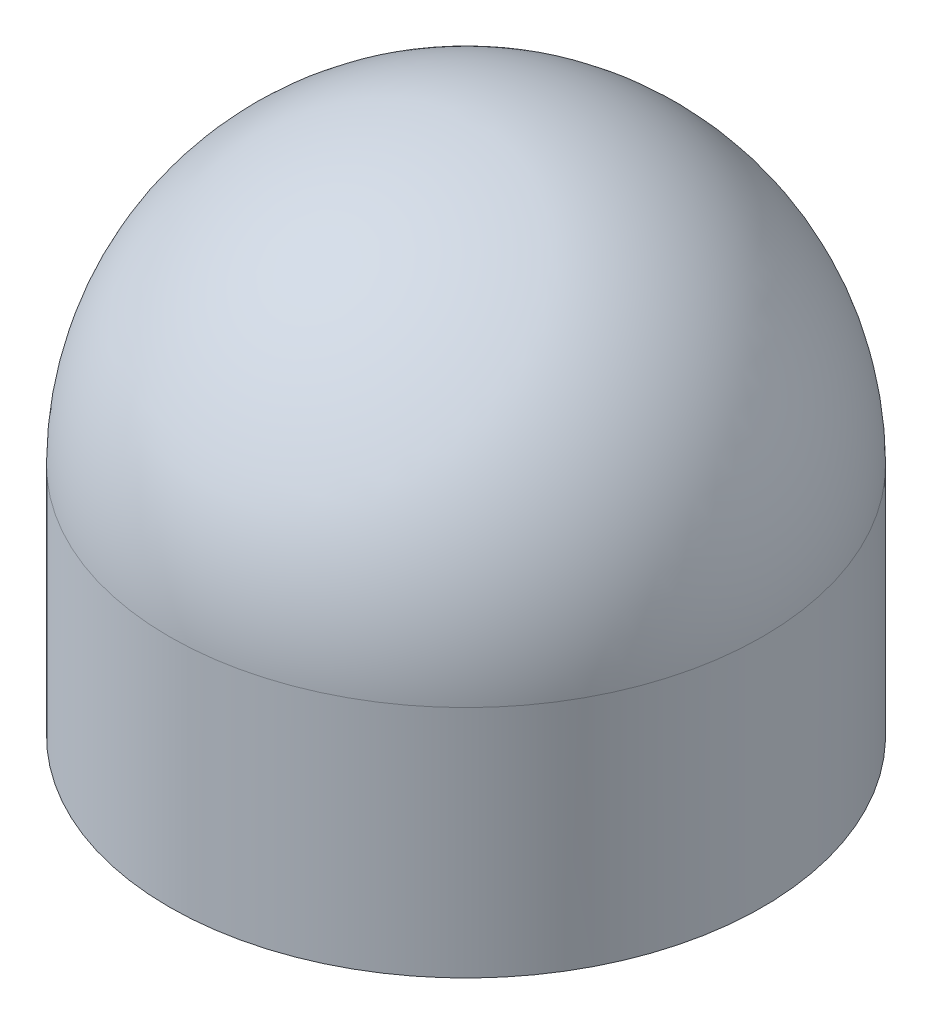
ISO-10303-21;
HEADER;
FILE_DESCRIPTION(('STEP AP214'),'2;1');
FILE_NAME('part.step','',(''),(''),'','','');
FILE_SCHEMA(('AUTOMOTIVE_DESIGN { 1 0 10303 214 1 1 1 1 }'));
ENDSEC;
DATA;
#1=APPLICATION_CONTEXT('core data for automotive mechanical design processes');
#2=APPLICATION_PROTOCOL_DEFINITION('international standard','automotive_design',2000,#1);
#3=PRODUCT_CONTEXT('',#1,'mechanical');
#4=PRODUCT('Part','Part','',(#3));
#5=PRODUCT_RELATED_PRODUCT_CATEGORY('part','',(#4));
#6=PRODUCT_DEFINITION_FORMATION('','',#4);
#7=PRODUCT_DEFINITION_CONTEXT('part definition',#1,'design');
#8=PRODUCT_DEFINITION('design','',#6,#7);
#9=PRODUCT_DEFINITION_SHAPE('','',#8);
#10=(LENGTH_UNIT() NAMED_UNIT(*) SI_UNIT(.MILLI.,.METRE.));
#11=(NAMED_UNIT(*) PLANE_ANGLE_UNIT() SI_UNIT($,.RADIAN.));
#12=(NAMED_UNIT(*) SI_UNIT($,.STERADIAN.) SOLID_ANGLE_UNIT());
#13=UNCERTAINTY_MEASURE_WITH_UNIT(LENGTH_MEASURE(1.E-05),#10,'distance_accuracy_value','');
#14=(GEOMETRIC_REPRESENTATION_CONTEXT(3) GLOBAL_UNCERTAINTY_ASSIGNED_CONTEXT((#13)) GLOBAL_UNIT_ASSIGNED_CONTEXT((#10,
#11,#12)) REPRESENTATION_CONTEXT('',''));
#15=CARTESIAN_POINT('',(0.,0.,0.));
#16=DIRECTION('',(0.,0.,1.));
#17=DIRECTION('',(1.,0.,0.));
#18=AXIS2_PLACEMENT_3D('',#15,#16,#17);
#19=CARTESIAN_POINT('',(0.,0.,0.));
#20=DIRECTION('',(0.,1.,0.));
#21=DIRECTION('',(0.,0.,1.));
#22=AXIS2_PLACEMENT_3D('',#19,#20,#21);
#23=PLANE('',#22);
#24=CARTESIAN_POINT('',(0.,0.,0.));
#25=DIRECTION('',(0.,1.,0.));
#26=DIRECTION('',(0.,0.,1.));
#27=AXIS2_PLACEMENT_3D('',#24,#25,#26);
#28=CIRCLE('',#27,9.652);
#29=CARTESIAN_POINT('',(0.,0.,9.652));
#30=VERTEX_POINT('',#29);
#31=EDGE_CURVE('E10',#30,#30,#28,.T.);
#32=ORIENTED_EDGE('',*,*,#31,.F.);
#33=EDGE_LOOP('',(#32));
#34=FACE_BOUND('',#33,.T.);
#35=ADVANCED_FACE('F32',(#34),#23,.F.);
#36=CARTESIAN_POINT('',(0.,17.272,0.));
#37=DIRECTION('',(0.,1.,0.));
#38=DIRECTION('',(0.,0.,1.));
#39=AXIS2_PLACEMENT_3D('',#36,#37,#38);
#40=CYLINDRICAL_SURFACE('',#39,9.652);
#41=CARTESIAN_POINT('',(0.,7.62,0.));
#42=DIRECTION('',(0.,1.,0.));
#43=DIRECTION('',(0.,0.,1.));
#44=AXIS2_PLACEMENT_3D('',#41,#42,#43);
#45=CIRCLE('',#44,9.652);
#46=CARTESIAN_POINT('',(0.,7.62,9.652));
#47=VERTEX_POINT('',#46);
#48=EDGE_CURVE('E38',#47,#47,#45,.T.);
#49=ORIENTED_EDGE('',*,*,#48,.F.);
#50=EDGE_LOOP('',(#49));
#51=FACE_BOUND('',#50,.T.);
#52=ORIENTED_EDGE('',*,*,#31,.T.);
#53=EDGE_LOOP('',(#52));
#54=FACE_BOUND('',#53,.T.);
#55=ADVANCED_FACE('F46',(#51,#54),#40,.T.);
#56=CARTESIAN_POINT('',(0.,7.62,0.));
#57=DIRECTION('',(0.,1.,0.));
#58=DIRECTION('',(1.,0.,0.));
#59=AXIS2_PLACEMENT_3D('',#56,#57,#58);
#60=SPHERICAL_SURFACE('',#59,9.652);
#61=ORIENTED_EDGE('',*,*,#48,.T.);
#62=EDGE_LOOP('',(#61));
#63=FACE_BOUND('',#62,.T.);
#64=ADVANCED_FACE('F44',(#63),#60,.T.);
#65=CLOSED_SHELL('',(#35,#55,#64));
#66=MANIFOLD_SOLID_BREP('B2',#65);
#67=ADVANCED_BREP_SHAPE_REPRESENTATION('',(#18,#66),#14);
#68=SHAPE_DEFINITION_REPRESENTATION(#9,#67);
ENDSEC;
END-ISO-10303-21;
